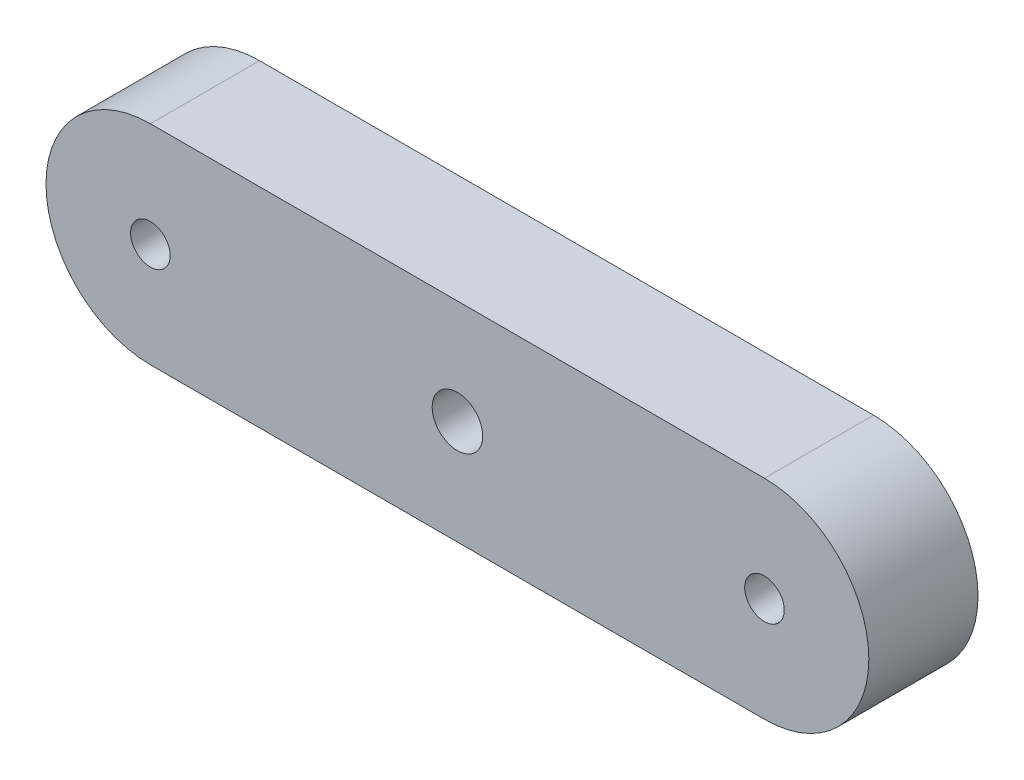
ISO-10303-21;
HEADER;
FILE_DESCRIPTION(('STEP AP214'),'2;1');
FILE_NAME('part.step','',(''),(''),'','','');
FILE_SCHEMA(('AUTOMOTIVE_DESIGN { 1 0 10303 214 1 1 1 1 }'));
ENDSEC;
DATA;
#1=APPLICATION_CONTEXT('core data for automotive mechanical design processes');
#2=APPLICATION_PROTOCOL_DEFINITION('international standard','automotive_design',2000,#1);
#3=PRODUCT_CONTEXT('',#1,'mechanical');
#4=PRODUCT('Part','Part','',(#3));
#5=PRODUCT_RELATED_PRODUCT_CATEGORY('part','',(#4));
#6=PRODUCT_DEFINITION_FORMATION('','',#4);
#7=PRODUCT_DEFINITION_CONTEXT('part definition',#1,'design');
#8=PRODUCT_DEFINITION('design','',#6,#7);
#9=PRODUCT_DEFINITION_SHAPE('','',#8);
#10=(LENGTH_UNIT() NAMED_UNIT(*) SI_UNIT(.MILLI.,.METRE.));
#11=(NAMED_UNIT(*) PLANE_ANGLE_UNIT() SI_UNIT($,.RADIAN.));
#12=(NAMED_UNIT(*) SI_UNIT($,.STERADIAN.) SOLID_ANGLE_UNIT());
#13=UNCERTAINTY_MEASURE_WITH_UNIT(LENGTH_MEASURE(1.E-05),#10,'distance_accuracy_value','');
#14=(GEOMETRIC_REPRESENTATION_CONTEXT(3) GLOBAL_UNCERTAINTY_ASSIGNED_CONTEXT((#13)) GLOBAL_UNIT_ASSIGNED_CONTEXT((#10,
#11,#12)) REPRESENTATION_CONTEXT('',''));
#15=CARTESIAN_POINT('',(0.,0.,0.));
#16=DIRECTION('',(0.,0.,1.));
#17=DIRECTION('',(1.,0.,0.));
#18=AXIS2_PLACEMENT_3D('',#15,#16,#17);
#19=CARTESIAN_POINT('',(0.,0.,8.));
#20=DIRECTION('',(0.,0.,1.));
#21=DIRECTION('',(1.,0.,0.));
#22=AXIS2_PLACEMENT_3D('',#19,#20,#21);
#23=PLANE('',#22);
#24=CARTESIAN_POINT('',(45.,0.,8.));
#25=DIRECTION('',(0.,0.,1.));
#26=DIRECTION('',(1.,0.,0.));
#27=AXIS2_PLACEMENT_3D('',#24,#25,#26);
#28=CIRCLE('',#27,1.45);
#29=CARTESIAN_POINT('',(46.45,0.,8.));
#30=VERTEX_POINT('',#29);
#31=EDGE_CURVE('E115',#30,#30,#28,.T.);
#32=ORIENTED_EDGE('',*,*,#31,.F.);
#33=EDGE_LOOP('',(#32));
#34=FACE_BOUND('',#33,.T.);
#35=CARTESIAN_POINT('',(0.,0.,8.));
#36=DIRECTION('',(0.,0.,1.));
#37=DIRECTION('',(1.,0.,0.));
#38=AXIS2_PLACEMENT_3D('',#35,#36,#37);
#39=CIRCLE('',#38,7.65);
#40=CARTESIAN_POINT('',(0.,7.65,8.));
#41=VERTEX_POINT('',#40);
#42=CARTESIAN_POINT('',(0.,-7.65,8.));
#43=VERTEX_POINT('',#42);
#44=EDGE_CURVE('E85',#41,#43,#39,.T.);
#45=ORIENTED_EDGE('',*,*,#44,.T.);
#46=DIRECTION('',(1.,0.,0.));
#47=VECTOR('',#46,1.);
#48=CARTESIAN_POINT('',(0.,-7.65,8.));
#49=LINE('',#48,#47);
#50=CARTESIAN_POINT('',(45.,-7.65,8.));
#51=VERTEX_POINT('',#50);
#52=EDGE_CURVE('E80',#43,#51,#49,.T.);
#53=ORIENTED_EDGE('',*,*,#52,.T.);
#54=CARTESIAN_POINT('',(45.,0.,8.));
#55=DIRECTION('',(0.,0.,1.));
#56=DIRECTION('',(1.,0.,0.));
#57=AXIS2_PLACEMENT_3D('',#54,#55,#56);
#58=CIRCLE('',#57,7.65);
#59=CARTESIAN_POINT('',(45.,7.65,8.));
#60=VERTEX_POINT('',#59);
#61=EDGE_CURVE('E83',#51,#60,#58,.T.);
#62=ORIENTED_EDGE('',*,*,#61,.T.);
#63=DIRECTION('',(-1.,0.,0.));
#64=VECTOR('',#63,1.);
#65=CARTESIAN_POINT('',(0.,7.65,8.));
#66=LINE('',#65,#64);
#67=EDGE_CURVE('E50',#60,#41,#66,.T.);
#68=ORIENTED_EDGE('',*,*,#67,.T.);
#69=EDGE_LOOP('',(#45,#53,#62,#68));
#70=FACE_BOUND('',#69,.T.);
#71=CARTESIAN_POINT('',(0.,0.,8.));
#72=DIRECTION('',(0.,0.,1.));
#73=DIRECTION('',(1.,0.,0.));
#74=AXIS2_PLACEMENT_3D('',#71,#72,#73);
#75=CIRCLE('',#74,1.45);
#76=CARTESIAN_POINT('',(1.45,0.,8.));
#77=VERTEX_POINT('',#76);
#78=EDGE_CURVE('E100',#77,#77,#75,.T.);
#79=ORIENTED_EDGE('',*,*,#78,.F.);
#80=EDGE_LOOP('',(#79));
#81=FACE_BOUND('',#80,.T.);
#82=CARTESIAN_POINT('',(22.5,0.,8.));
#83=DIRECTION('',(0.,0.,1.));
#84=DIRECTION('',(1.,0.,0.));
#85=AXIS2_PLACEMENT_3D('',#82,#83,#84);
#86=CIRCLE('',#85,1.85);
#87=CARTESIAN_POINT('',(24.35,0.,8.));
#88=VERTEX_POINT('',#87);
#89=EDGE_CURVE('E121',#88,#88,#86,.F.);
#90=ORIENTED_EDGE('',*,*,#89,.T.);
#91=EDGE_LOOP('',(#90));
#92=FACE_BOUND('',#91,.T.);
#93=ADVANCED_FACE('F33',(#34,#70,#81,#92),#23,.T.);
#94=CARTESIAN_POINT('',(0.,0.,0.));
#95=DIRECTION('',(0.,0.,1.));
#96=DIRECTION('',(1.,0.,0.));
#97=AXIS2_PLACEMENT_3D('',#94,#95,#96);
#98=PLANE('',#97);
#99=CARTESIAN_POINT('',(0.,0.,0.));
#100=DIRECTION('',(0.,0.,1.));
#101=DIRECTION('',(1.,0.,0.));
#102=AXIS2_PLACEMENT_3D('',#99,#100,#101);
#103=CIRCLE('',#102,7.65);
#104=CARTESIAN_POINT('',(0.,7.65,0.));
#105=VERTEX_POINT('',#104);
#106=CARTESIAN_POINT('',(0.,-7.65,0.));
#107=VERTEX_POINT('',#106);
#108=EDGE_CURVE('E97',#105,#107,#103,.T.);
#109=ORIENTED_EDGE('',*,*,#108,.F.);
#110=DIRECTION('',(-1.,0.,0.));
#111=VECTOR('',#110,1.);
#112=CARTESIAN_POINT('',(0.,7.65,0.));
#113=LINE('',#112,#111);
#114=CARTESIAN_POINT('',(45.,7.65,0.));
#115=VERTEX_POINT('',#114);
#116=EDGE_CURVE('E73',#115,#105,#113,.T.);
#117=ORIENTED_EDGE('',*,*,#116,.F.);
#118=CARTESIAN_POINT('',(45.,0.,0.));
#119=DIRECTION('',(0.,0.,1.));
#120=DIRECTION('',(1.,0.,0.));
#121=AXIS2_PLACEMENT_3D('',#118,#119,#120);
#122=CIRCLE('',#121,7.65);
#123=CARTESIAN_POINT('',(45.,-7.65,0.));
#124=VERTEX_POINT('',#123);
#125=EDGE_CURVE('E67',#124,#115,#122,.T.);
#126=ORIENTED_EDGE('',*,*,#125,.F.);
#127=DIRECTION('',(1.,0.,0.));
#128=VECTOR('',#127,1.);
#129=CARTESIAN_POINT('',(0.,-7.65,0.));
#130=LINE('',#129,#128);
#131=EDGE_CURVE('E89',#107,#124,#130,.T.);
#132=ORIENTED_EDGE('',*,*,#131,.F.);
#133=EDGE_LOOP('',(#109,#117,#126,#132));
#134=FACE_BOUND('',#133,.T.);
#135=CARTESIAN_POINT('',(0.,0.,0.));
#136=DIRECTION('',(0.,0.,1.));
#137=DIRECTION('',(1.,0.,0.));
#138=AXIS2_PLACEMENT_3D('',#135,#136,#137);
#139=CIRCLE('',#138,1.45);
#140=CARTESIAN_POINT('',(1.45,0.,0.));
#141=VERTEX_POINT('',#140);
#142=EDGE_CURVE('E112',#141,#141,#139,.T.);
#143=ORIENTED_EDGE('',*,*,#142,.T.);
#144=EDGE_LOOP('',(#143));
#145=FACE_BOUND('',#144,.T.);
#146=CARTESIAN_POINT('',(45.,0.,0.));
#147=DIRECTION('',(0.,0.,1.));
#148=DIRECTION('',(1.,0.,0.));
#149=AXIS2_PLACEMENT_3D('',#146,#147,#148);
#150=CIRCLE('',#149,1.45);
#151=CARTESIAN_POINT('',(46.45,0.,0.));
#152=VERTEX_POINT('',#151);
#153=EDGE_CURVE('E118',#152,#152,#150,.T.);
#154=ORIENTED_EDGE('',*,*,#153,.T.);
#155=EDGE_LOOP('',(#154));
#156=FACE_BOUND('',#155,.T.);
#157=CARTESIAN_POINT('',(22.5,0.,0.));
#158=DIRECTION('',(0.,0.,-1.));
#159=DIRECTION('',(-1.,0.,0.));
#160=AXIS2_PLACEMENT_3D('',#157,#158,#159);
#161=CIRCLE('',#160,1.85);
#162=CARTESIAN_POINT('',(20.65,0.,0.));
#163=VERTEX_POINT('',#162);
#164=EDGE_CURVE('E126',#163,#163,#161,.T.);
#165=ORIENTED_EDGE('',*,*,#164,.F.);
#166=EDGE_LOOP('',(#165));
#167=FACE_BOUND('',#166,.T.);
#168=ADVANCED_FACE('F108',(#134,#145,#156,#167),#98,.F.);
#169=CARTESIAN_POINT('',(0.,0.,8.));
#170=DIRECTION('',(0.,0.,-1.));
#171=DIRECTION('',(-1.,0.,0.));
#172=AXIS2_PLACEMENT_3D('',#169,#170,#171);
#173=CYLINDRICAL_SURFACE('',#172,7.65);
#174=ORIENTED_EDGE('',*,*,#108,.T.);
#175=DIRECTION('',(0.,0.,-1.));
#176=VECTOR('',#175,1.);
#177=CARTESIAN_POINT('',(0.,-7.65,8.));
#178=LINE('',#177,#176);
#179=EDGE_CURVE('E11',#43,#107,#178,.T.);
#180=ORIENTED_EDGE('',*,*,#179,.F.);
#181=ORIENTED_EDGE('',*,*,#44,.F.);
#182=DIRECTION('',(0.,0.,-1.));
#183=VECTOR('',#182,1.);
#184=CARTESIAN_POINT('',(0.,7.65,8.));
#185=LINE('',#184,#183);
#186=EDGE_CURVE('E93',#41,#105,#185,.T.);
#187=ORIENTED_EDGE('',*,*,#186,.T.);
#188=EDGE_LOOP('',(#174,#180,#181,#187));
#189=FACE_BOUND('',#188,.T.);
#190=ADVANCED_FACE('F35',(#189),#173,.T.);
#191=CARTESIAN_POINT('',(0.,-7.65,8.));
#192=DIRECTION('',(0.,1.,0.));
#193=DIRECTION('',(0.,0.,1.));
#194=AXIS2_PLACEMENT_3D('',#191,#192,#193);
#195=PLANE('',#194);
#196=ORIENTED_EDGE('',*,*,#131,.T.);
#197=DIRECTION('',(0.,0.,-1.));
#198=VECTOR('',#197,1.);
#199=CARTESIAN_POINT('',(45.,-7.65,8.));
#200=LINE('',#199,#198);
#201=EDGE_CURVE('E42',#51,#124,#200,.T.);
#202=ORIENTED_EDGE('',*,*,#201,.F.);
#203=ORIENTED_EDGE('',*,*,#52,.F.);
#204=ORIENTED_EDGE('',*,*,#179,.T.);
#205=EDGE_LOOP('',(#196,#202,#203,#204));
#206=FACE_BOUND('',#205,.T.);
#207=ADVANCED_FACE('F88',(#206),#195,.F.);
#208=CARTESIAN_POINT('',(45.,0.,8.));
#209=DIRECTION('',(0.,0.,-1.));
#210=DIRECTION('',(-1.,0.,0.));
#211=AXIS2_PLACEMENT_3D('',#208,#209,#210);
#212=CYLINDRICAL_SURFACE('',#211,7.65);
#213=ORIENTED_EDGE('',*,*,#125,.T.);
#214=DIRECTION('',(0.,0.,-1.));
#215=VECTOR('',#214,1.);
#216=CARTESIAN_POINT('',(45.,7.65,8.));
#217=LINE('',#216,#215);
#218=EDGE_CURVE('E90',#60,#115,#217,.T.);
#219=ORIENTED_EDGE('',*,*,#218,.F.);
#220=ORIENTED_EDGE('',*,*,#61,.F.);
#221=ORIENTED_EDGE('',*,*,#201,.T.);
#222=EDGE_LOOP('',(#213,#219,#220,#221));
#223=FACE_BOUND('',#222,.T.);
#224=ADVANCED_FACE('F91',(#223),#212,.T.);
#225=CARTESIAN_POINT('',(0.,7.65,8.));
#226=DIRECTION('',(0.,-1.,0.));
#227=DIRECTION('',(0.,0.,-1.));
#228=AXIS2_PLACEMENT_3D('',#225,#226,#227);
#229=PLANE('',#228);
#230=ORIENTED_EDGE('',*,*,#116,.T.);
#231=ORIENTED_EDGE('',*,*,#186,.F.);
#232=ORIENTED_EDGE('',*,*,#67,.F.);
#233=ORIENTED_EDGE('',*,*,#218,.T.);
#234=EDGE_LOOP('',(#230,#231,#232,#233));
#235=FACE_BOUND('',#234,.T.);
#236=ADVANCED_FACE('F105',(#235),#229,.F.);
#237=CARTESIAN_POINT('',(0.,0.,8.));
#238=DIRECTION('',(0.,0.,-1.));
#239=DIRECTION('',(-1.,0.,0.));
#240=AXIS2_PLACEMENT_3D('',#237,#238,#239);
#241=CYLINDRICAL_SURFACE('',#240,1.45);
#242=ORIENTED_EDGE('',*,*,#78,.T.);
#243=EDGE_LOOP('',(#242));
#244=FACE_BOUND('',#243,.T.);
#245=ORIENTED_EDGE('',*,*,#142,.F.);
#246=EDGE_LOOP('',(#245));
#247=FACE_BOUND('',#246,.T.);
#248=ADVANCED_FACE('F145',(#244,#247),#241,.F.);
#249=CARTESIAN_POINT('',(45.,0.,8.));
#250=DIRECTION('',(0.,0.,-1.));
#251=DIRECTION('',(-1.,0.,0.));
#252=AXIS2_PLACEMENT_3D('',#249,#250,#251);
#253=CYLINDRICAL_SURFACE('',#252,1.45);
#254=ORIENTED_EDGE('',*,*,#31,.T.);
#255=EDGE_LOOP('',(#254));
#256=FACE_BOUND('',#255,.T.);
#257=ORIENTED_EDGE('',*,*,#153,.F.);
#258=EDGE_LOOP('',(#257));
#259=FACE_BOUND('',#258,.T.);
#260=ADVANCED_FACE('F166',(#256,#259),#253,.F.);
#261=CARTESIAN_POINT('',(22.5,0.,23.0058631590978));
#262=DIRECTION('',(0.,0.,-1.));
#263=DIRECTION('',(-1.,0.,0.));
#264=AXIS2_PLACEMENT_3D('',#261,#262,#263);
#265=CYLINDRICAL_SURFACE('',#264,1.85);
#266=ORIENTED_EDGE('',*,*,#164,.T.);
#267=EDGE_LOOP('',(#266));
#268=FACE_BOUND('',#267,.T.);
#269=ORIENTED_EDGE('',*,*,#89,.F.);
#270=EDGE_LOOP('',(#269));
#271=FACE_BOUND('',#270,.T.);
#272=ADVANCED_FACE('F130',(#268,#271),#265,.F.);
#273=CLOSED_SHELL('',(#93,#168,#190,#207,#224,#236,#248,#260,#272));
#274=MANIFOLD_SOLID_BREP('B2',#273);
#275=ADVANCED_BREP_SHAPE_REPRESENTATION('',(#18,#274),#14);
#276=SHAPE_DEFINITION_REPRESENTATION(#9,#275);
ENDSEC;
END-ISO-10303-21;
